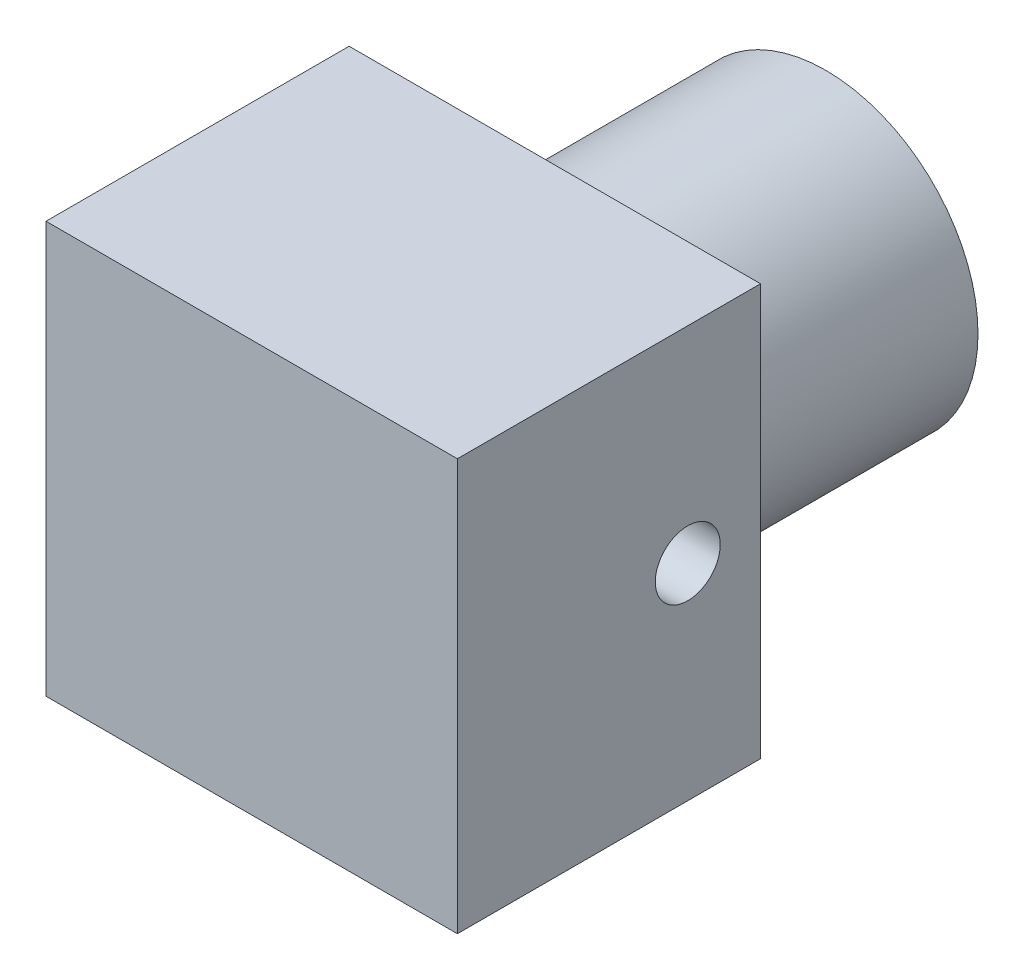
ISO-10303-21;
HEADER;
FILE_DESCRIPTION(('STEP AP214'),'2;1');
FILE_NAME('part.step','',(''),(''),'','','');
FILE_SCHEMA(('AUTOMOTIVE_DESIGN { 1 0 10303 214 1 1 1 1 }'));
ENDSEC;
DATA;
#1=APPLICATION_CONTEXT('core data for automotive mechanical design processes');
#2=APPLICATION_PROTOCOL_DEFINITION('international standard','automotive_design',2000,#1);
#3=PRODUCT_CONTEXT('',#1,'mechanical');
#4=PRODUCT('Part','Part','',(#3));
#5=PRODUCT_RELATED_PRODUCT_CATEGORY('part','',(#4));
#6=PRODUCT_DEFINITION_FORMATION('','',#4);
#7=PRODUCT_DEFINITION_CONTEXT('part definition',#1,'design');
#8=PRODUCT_DEFINITION('design','',#6,#7);
#9=PRODUCT_DEFINITION_SHAPE('','',#8);
#10=(LENGTH_UNIT() NAMED_UNIT(*) SI_UNIT(.MILLI.,.METRE.));
#11=(NAMED_UNIT(*) PLANE_ANGLE_UNIT() SI_UNIT($,.RADIAN.));
#12=(NAMED_UNIT(*) SI_UNIT($,.STERADIAN.) SOLID_ANGLE_UNIT());
#13=UNCERTAINTY_MEASURE_WITH_UNIT(LENGTH_MEASURE(1.E-05),#10,'distance_accuracy_value','');
#14=(GEOMETRIC_REPRESENTATION_CONTEXT(3) GLOBAL_UNCERTAINTY_ASSIGNED_CONTEXT((#13)) GLOBAL_UNIT_ASSIGNED_CONTEXT((#10,
#11,#12)) REPRESENTATION_CONTEXT('',''));
#15=CARTESIAN_POINT('',(0.,0.,0.));
#16=DIRECTION('',(0.,0.,1.));
#17=DIRECTION('',(1.,0.,0.));
#18=AXIS2_PLACEMENT_3D('',#15,#16,#17);
#19=CARTESIAN_POINT('',(0.,0.,12.52));
#20=DIRECTION('',(0.,0.,-1.));
#21=DIRECTION('',(-1.,0.,0.));
#22=AXIS2_PLACEMENT_3D('',#19,#20,#21);
#23=CYLINDRICAL_SURFACE('',#22,7.025);
#24=CARTESIAN_POINT('',(0.,0.,12.52));
#25=DIRECTION('',(0.,0.,1.));
#26=DIRECTION('',(1.,0.,0.));
#27=AXIS2_PLACEMENT_3D('',#24,#25,#26);
#28=CIRCLE('',#27,7.025);
#29=CARTESIAN_POINT('',(7.025,0.,12.52));
#30=VERTEX_POINT('',#29);
#31=EDGE_CURVE('E11',#30,#30,#28,.T.);
#32=ORIENTED_EDGE('',*,*,#31,.F.);
#33=EDGE_LOOP('',(#32));
#34=FACE_BOUND('',#33,.T.);
#35=CARTESIAN_POINT('',(0.,0.,0.));
#36=DIRECTION('',(0.,0.,1.));
#37=DIRECTION('',(1.,0.,0.));
#38=AXIS2_PLACEMENT_3D('',#35,#36,#37);
#39=CIRCLE('',#38,7.025);
#40=CARTESIAN_POINT('',(7.025,0.,0.));
#41=VERTEX_POINT('',#40);
#42=EDGE_CURVE('E46',#41,#41,#39,.T.);
#43=ORIENTED_EDGE('',*,*,#42,.T.);
#44=EDGE_LOOP('',(#43));
#45=FACE_BOUND('',#44,.T.);
#46=ADVANCED_FACE('F43',(#34,#45),#23,.T.);
#47=CARTESIAN_POINT('',(0.,0.,0.));
#48=DIRECTION('',(0.,0.,1.));
#49=DIRECTION('',(1.,0.,0.));
#50=AXIS2_PLACEMENT_3D('',#47,#48,#49);
#51=PLANE('',#50);
#52=ORIENTED_EDGE('',*,*,#42,.F.);
#53=EDGE_LOOP('',(#52));
#54=FACE_BOUND('',#53,.T.);
#55=ADVANCED_FACE('F136',(#54),#51,.F.);
#56=CARTESIAN_POINT('',(9.5,-9.5,26.52));
#57=DIRECTION('',(-1.,0.,0.));
#58=DIRECTION('',(0.,0.,1.));
#59=AXIS2_PLACEMENT_3D('',#56,#57,#58);
#60=PLANE('',#59);
#61=CARTESIAN_POINT('',(9.5,0.,15.88));
#62=DIRECTION('',(-1.,0.,0.));
#63=DIRECTION('',(0.,0.,1.));
#64=AXIS2_PLACEMENT_3D('',#61,#62,#63);
#65=CIRCLE('',#64,1.5);
#66=CARTESIAN_POINT('',(9.5,0.,17.38));
#67=VERTEX_POINT('',#66);
#68=EDGE_CURVE('E119',#67,#67,#65,.T.);
#69=ORIENTED_EDGE('',*,*,#68,.T.);
#70=EDGE_LOOP('',(#69));
#71=FACE_BOUND('',#70,.T.);
#72=DIRECTION('',(0.,1.,0.));
#73=VECTOR('',#72,1.);
#74=CARTESIAN_POINT('',(9.5,-9.5,12.52));
#75=LINE('',#74,#73);
#76=CARTESIAN_POINT('',(9.5,-9.5,12.52));
#77=VERTEX_POINT('',#76);
#78=CARTESIAN_POINT('',(9.5,9.5,12.52));
#79=VERTEX_POINT('',#78);
#80=EDGE_CURVE('E115',#77,#79,#75,.T.);
#81=ORIENTED_EDGE('',*,*,#80,.T.);
#82=DIRECTION('',(0.,0.,-1.));
#83=VECTOR('',#82,1.);
#84=CARTESIAN_POINT('',(9.5,9.5,26.52));
#85=LINE('',#84,#83);
#86=CARTESIAN_POINT('',(9.5,9.5,26.52));
#87=VERTEX_POINT('',#86);
#88=EDGE_CURVE('E104',#87,#79,#85,.T.);
#89=ORIENTED_EDGE('',*,*,#88,.F.);
#90=DIRECTION('',(0.,1.,0.));
#91=VECTOR('',#90,1.);
#92=CARTESIAN_POINT('',(9.5,-9.5,26.52));
#93=LINE('',#92,#91);
#94=CARTESIAN_POINT('',(9.5,-9.5,26.52));
#95=VERTEX_POINT('',#94);
#96=EDGE_CURVE('E96',#95,#87,#93,.T.);
#97=ORIENTED_EDGE('',*,*,#96,.F.);
#98=DIRECTION('',(0.,0.,-1.));
#99=VECTOR('',#98,1.);
#100=CARTESIAN_POINT('',(9.5,-9.5,26.52));
#101=LINE('',#100,#99);
#102=EDGE_CURVE('E111',#95,#77,#101,.T.);
#103=ORIENTED_EDGE('',*,*,#102,.T.);
#104=EDGE_LOOP('',(#81,#89,#97,#103));
#105=FACE_BOUND('',#104,.T.);
#106=ADVANCED_FACE('F138',(#71,#105),#60,.F.);
#107=CARTESIAN_POINT('',(-9.5,9.5,26.52));
#108=DIRECTION('',(0.,-1.,0.));
#109=DIRECTION('',(0.,0.,-1.));
#110=AXIS2_PLACEMENT_3D('',#107,#108,#109);
#111=PLANE('',#110);
#112=DIRECTION('',(-1.,0.,0.));
#113=VECTOR('',#112,1.);
#114=CARTESIAN_POINT('',(-9.5,9.5,12.52));
#115=LINE('',#114,#113);
#116=CARTESIAN_POINT('',(-9.5,9.5,12.52));
#117=VERTEX_POINT('',#116);
#118=EDGE_CURVE('E102',#79,#117,#115,.T.);
#119=ORIENTED_EDGE('',*,*,#118,.T.);
#120=DIRECTION('',(0.,0.,-1.));
#121=VECTOR('',#120,1.);
#122=CARTESIAN_POINT('',(-9.5,9.5,26.52));
#123=LINE('',#122,#121);
#124=CARTESIAN_POINT('',(-9.5,9.5,26.52));
#125=VERTEX_POINT('',#124);
#126=EDGE_CURVE('E100',#125,#117,#123,.T.);
#127=ORIENTED_EDGE('',*,*,#126,.F.);
#128=DIRECTION('',(-1.,0.,0.));
#129=VECTOR('',#128,1.);
#130=CARTESIAN_POINT('',(-9.5,9.5,26.52));
#131=LINE('',#130,#129);
#132=EDGE_CURVE('E91',#87,#125,#131,.T.);
#133=ORIENTED_EDGE('',*,*,#132,.F.);
#134=ORIENTED_EDGE('',*,*,#88,.T.);
#135=EDGE_LOOP('',(#119,#127,#133,#134));
#136=FACE_BOUND('',#135,.T.);
#137=ADVANCED_FACE('F101',(#136),#111,.F.);
#138=CARTESIAN_POINT('',(-9.5,-9.5,26.52));
#139=DIRECTION('',(1.,0.,0.));
#140=DIRECTION('',(0.,0.,-1.));
#141=AXIS2_PLACEMENT_3D('',#138,#139,#140);
#142=PLANE('',#141);
#143=CARTESIAN_POINT('',(-9.5,0.,15.88));
#144=DIRECTION('',(-1.,0.,0.));
#145=DIRECTION('',(0.,0.,1.));
#146=AXIS2_PLACEMENT_3D('',#143,#144,#145);
#147=CIRCLE('',#146,1.5);
#148=CARTESIAN_POINT('',(-9.5,0.,17.38));
#149=VERTEX_POINT('',#148);
#150=EDGE_CURVE('E171',#149,#149,#147,.T.);
#151=ORIENTED_EDGE('',*,*,#150,.F.);
#152=EDGE_LOOP('',(#151));
#153=FACE_BOUND('',#152,.T.);
#154=DIRECTION('',(0.,-1.,0.));
#155=VECTOR('',#154,1.);
#156=CARTESIAN_POINT('',(-9.5,-9.5,12.52));
#157=LINE('',#156,#155);
#158=CARTESIAN_POINT('',(-9.5,-9.5,12.52));
#159=VERTEX_POINT('',#158);
#160=EDGE_CURVE('E77',#117,#159,#157,.T.);
#161=ORIENTED_EDGE('',*,*,#160,.T.);
#162=DIRECTION('',(0.,0.,-1.));
#163=VECTOR('',#162,1.);
#164=CARTESIAN_POINT('',(-9.5,-9.5,26.52));
#165=LINE('',#164,#163);
#166=CARTESIAN_POINT('',(-9.5,-9.5,26.52));
#167=VERTEX_POINT('',#166);
#168=EDGE_CURVE('E105',#167,#159,#165,.T.);
#169=ORIENTED_EDGE('',*,*,#168,.F.);
#170=DIRECTION('',(0.,-1.,0.));
#171=VECTOR('',#170,1.);
#172=CARTESIAN_POINT('',(-9.5,-9.5,26.52));
#173=LINE('',#172,#171);
#174=EDGE_CURVE('E94',#125,#167,#173,.T.);
#175=ORIENTED_EDGE('',*,*,#174,.F.);
#176=ORIENTED_EDGE('',*,*,#126,.T.);
#177=EDGE_LOOP('',(#161,#169,#175,#176));
#178=FACE_BOUND('',#177,.T.);
#179=ADVANCED_FACE('F107',(#153,#178),#142,.F.);
#180=CARTESIAN_POINT('',(-9.5,-9.5,26.52));
#181=DIRECTION('',(0.,1.,0.));
#182=DIRECTION('',(0.,0.,1.));
#183=AXIS2_PLACEMENT_3D('',#180,#181,#182);
#184=PLANE('',#183);
#185=DIRECTION('',(1.,0.,0.));
#186=VECTOR('',#185,1.);
#187=CARTESIAN_POINT('',(-9.5,-9.5,12.52));
#188=LINE('',#187,#186);
#189=EDGE_CURVE('E83',#159,#77,#188,.T.);
#190=ORIENTED_EDGE('',*,*,#189,.T.);
#191=ORIENTED_EDGE('',*,*,#102,.F.);
#192=DIRECTION('',(1.,0.,0.));
#193=VECTOR('',#192,1.);
#194=CARTESIAN_POINT('',(-9.5,-9.5,26.52));
#195=LINE('',#194,#193);
#196=EDGE_CURVE('E60',#167,#95,#195,.T.);
#197=ORIENTED_EDGE('',*,*,#196,.F.);
#198=ORIENTED_EDGE('',*,*,#168,.T.);
#199=EDGE_LOOP('',(#190,#191,#197,#198));
#200=FACE_BOUND('',#199,.T.);
#201=ADVANCED_FACE('F151',(#200),#184,.F.);
#202=CARTESIAN_POINT('',(0.,0.,26.52));
#203=DIRECTION('',(0.,0.,-1.));
#204=DIRECTION('',(-1.,0.,0.));
#205=AXIS2_PLACEMENT_3D('',#202,#203,#204);
#206=PLANE('',#205);
#207=ORIENTED_EDGE('',*,*,#96,.T.);
#208=ORIENTED_EDGE('',*,*,#132,.T.);
#209=ORIENTED_EDGE('',*,*,#174,.T.);
#210=ORIENTED_EDGE('',*,*,#196,.T.);
#211=EDGE_LOOP('',(#207,#208,#209,#210));
#212=FACE_BOUND('',#211,.T.);
#213=ADVANCED_FACE('F92',(#212),#206,.F.);
#214=CARTESIAN_POINT('',(0.,0.,12.52));
#215=DIRECTION('',(0.,0.,-1.));
#216=DIRECTION('',(-1.,0.,0.));
#217=AXIS2_PLACEMENT_3D('',#214,#215,#216);
#218=PLANE('',#217);
#219=ORIENTED_EDGE('',*,*,#31,.T.);
#220=EDGE_LOOP('',(#219));
#221=FACE_BOUND('',#220,.T.);
#222=ORIENTED_EDGE('',*,*,#80,.F.);
#223=ORIENTED_EDGE('',*,*,#189,.F.);
#224=ORIENTED_EDGE('',*,*,#160,.F.);
#225=ORIENTED_EDGE('',*,*,#118,.F.);
#226=EDGE_LOOP('',(#222,#223,#224,#225));
#227=FACE_BOUND('',#226,.T.);
#228=ADVANCED_FACE('F155',(#221,#227),#218,.T.);
#229=CARTESIAN_POINT('',(9.5,0.,15.88));
#230=DIRECTION('',(-1.,0.,0.));
#231=DIRECTION('',(0.,0.,1.));
#232=AXIS2_PLACEMENT_3D('',#229,#230,#231);
#233=CYLINDRICAL_SURFACE('',#232,1.5);
#234=ORIENTED_EDGE('',*,*,#68,.F.);
#235=EDGE_LOOP('',(#234));
#236=FACE_BOUND('',#235,.T.);
#237=ORIENTED_EDGE('',*,*,#150,.T.);
#238=EDGE_LOOP('',(#237));
#239=FACE_BOUND('',#238,.T.);
#240=ADVANCED_FACE('F158',(#236,#239),#233,.F.);
#241=CLOSED_SHELL('',(#46,#55,#106,#137,#179,#201,#213,#228,#240));
#242=MANIFOLD_SOLID_BREP('B2',#241);
#243=ADVANCED_BREP_SHAPE_REPRESENTATION('',(#18,#242),#14);
#244=SHAPE_DEFINITION_REPRESENTATION(#9,#243);
ENDSEC;
END-ISO-10303-21;
